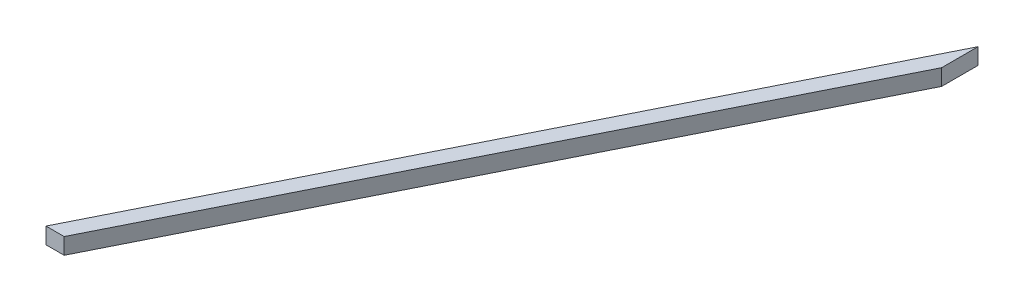
ISO-10303-21;
HEADER;
FILE_DESCRIPTION(('STEP AP214'),'2;1');
FILE_NAME('part.step','',(''),(''),'','','');
FILE_SCHEMA(('AUTOMOTIVE_DESIGN { 1 0 10303 214 1 1 1 1 }'));
ENDSEC;
DATA;
#1=APPLICATION_CONTEXT('core data for automotive mechanical design processes');
#2=APPLICATION_PROTOCOL_DEFINITION('international standard','automotive_design',2000,#1);
#3=PRODUCT_CONTEXT('',#1,'mechanical');
#4=PRODUCT('Part','Part','',(#3));
#5=PRODUCT_RELATED_PRODUCT_CATEGORY('part','',(#4));
#6=PRODUCT_DEFINITION_FORMATION('','',#4);
#7=PRODUCT_DEFINITION_CONTEXT('part definition',#1,'design');
#8=PRODUCT_DEFINITION('design','',#6,#7);
#9=PRODUCT_DEFINITION_SHAPE('','',#8);
#10=(LENGTH_UNIT() NAMED_UNIT(*) SI_UNIT(.MILLI.,.METRE.));
#11=(NAMED_UNIT(*) PLANE_ANGLE_UNIT() SI_UNIT($,.RADIAN.));
#12=(NAMED_UNIT(*) SI_UNIT($,.STERADIAN.) SOLID_ANGLE_UNIT());
#13=UNCERTAINTY_MEASURE_WITH_UNIT(LENGTH_MEASURE(1.E-05),#10,'distance_accuracy_value','');
#14=(GEOMETRIC_REPRESENTATION_CONTEXT(3) GLOBAL_UNCERTAINTY_ASSIGNED_CONTEXT((#13)) GLOBAL_UNIT_ASSIGNED_CONTEXT((#10,
#11,#12)) REPRESENTATION_CONTEXT('',''));
#15=CARTESIAN_POINT('',(0.,0.,0.));
#16=DIRECTION('',(0.,0.,1.));
#17=DIRECTION('',(1.,0.,0.));
#18=AXIS2_PLACEMENT_3D('',#15,#16,#17);
#19=CARTESIAN_POINT('',(-459.084020271651,25.4,-229.542010135826));
#20=DIRECTION('',(-0.894427190999916,0.,-0.447213595499958));
#21=DIRECTION('',(-0.447213595499958,0.,0.894427190999916));
#22=AXIS2_PLACEMENT_3D('',#19,#20,#21);
#23=PLANE('',#22);
#24=DIRECTION('',(0.447213595499958,0.,-0.894427190999916));
#25=VECTOR('',#24,1.);
#26=CARTESIAN_POINT('',(-459.084020271651,0.,-229.542010135826));
#27=LINE('',#26,#25);
#28=CARTESIAN_POINT('',(-615.813253187665,0.,83.9164556962026));
#29=VERTEX_POINT('',#28);
#30=CARTESIAN_POINT('',(-130.215189873418,0.,-887.279670932293));
#31=VERTEX_POINT('',#30);
#32=EDGE_CURVE('E109',#29,#31,#27,.T.);
#33=ORIENTED_EDGE('',*,*,#32,.F.);
#34=DIRECTION('',(0.,-1.,0.));
#35=VECTOR('',#34,1.);
#36=CARTESIAN_POINT('',(-615.813253187665,25.4,83.9164556962026));
#37=LINE('',#36,#35);
#38=CARTESIAN_POINT('',(-615.813253187665,25.4,83.9164556962026));
#39=VERTEX_POINT('',#38);
#40=EDGE_CURVE('E11',#39,#29,#37,.T.);
#41=ORIENTED_EDGE('',*,*,#40,.F.);
#42=DIRECTION('',(0.447213595499958,0.,-0.894427190999916));
#43=VECTOR('',#42,1.);
#44=CARTESIAN_POINT('',(-459.084020271651,25.4,-229.542010135826));
#45=LINE('',#44,#43);
#46=CARTESIAN_POINT('',(-130.215189873418,25.4,-887.279670932293));
#47=VERTEX_POINT('',#46);
#48=EDGE_CURVE('E99',#39,#47,#45,.T.);
#49=ORIENTED_EDGE('',*,*,#48,.T.);
#50=DIRECTION('',(0.,-1.,0.));
#51=VECTOR('',#50,1.);
#52=CARTESIAN_POINT('',(-130.215189873418,25.4,-887.279670932293));
#53=LINE('',#52,#51);
#54=EDGE_CURVE('E80',#47,#31,#53,.T.);
#55=ORIENTED_EDGE('',*,*,#54,.T.);
#56=EDGE_LOOP('',(#33,#41,#49,#55));
#57=FACE_BOUND('',#56,.T.);
#58=ADVANCED_FACE('F41',(#57),#23,.T.);
#59=CARTESIAN_POINT('',(0.,25.4,83.9164556962026));
#60=DIRECTION('',(0.,0.,1.));
#61=DIRECTION('',(1.,0.,0.));
#62=AXIS2_PLACEMENT_3D('',#59,#60,#61);
#63=PLANE('',#62);
#64=DIRECTION('',(-1.,0.,0.));
#65=VECTOR('',#64,1.);
#66=CARTESIAN_POINT('',(0.,0.,83.9164556962026));
#67=LINE('',#66,#65);
#68=CARTESIAN_POINT('',(-587.415189873418,0.,83.9164556962026));
#69=VERTEX_POINT('',#68);
#70=EDGE_CURVE('E91',#69,#29,#67,.T.);
#71=ORIENTED_EDGE('',*,*,#70,.F.);
#72=DIRECTION('',(0.,-1.,0.));
#73=VECTOR('',#72,1.);
#74=CARTESIAN_POINT('',(-587.415189873418,25.4,83.9164556962026));
#75=LINE('',#74,#73);
#76=CARTESIAN_POINT('',(-587.415189873418,25.4,83.9164556962026));
#77=VERTEX_POINT('',#76);
#78=EDGE_CURVE('E50',#77,#69,#75,.T.);
#79=ORIENTED_EDGE('',*,*,#78,.F.);
#80=DIRECTION('',(-1.,0.,0.));
#81=VECTOR('',#80,1.);
#82=CARTESIAN_POINT('',(0.,25.4,83.9164556962026));
#83=LINE('',#82,#81);
#84=EDGE_CURVE('E89',#77,#39,#83,.T.);
#85=ORIENTED_EDGE('',*,*,#84,.T.);
#86=ORIENTED_EDGE('',*,*,#40,.T.);
#87=EDGE_LOOP('',(#71,#79,#85,#86));
#88=FACE_BOUND('',#87,.T.);
#89=ADVANCED_FACE('F88',(#88),#63,.T.);
#90=CARTESIAN_POINT('',(-436.365569620253,25.4,-218.182784810127));
#91=DIRECTION('',(0.894427190999916,0.,0.447213595499958));
#92=DIRECTION('',(0.447213595499958,0.,-0.894427190999916));
#93=AXIS2_PLACEMENT_3D('',#90,#91,#92);
#94=PLANE('',#93);
#95=DIRECTION('',(-0.447213595499958,0.,0.894427190999916));
#96=VECTOR('',#95,1.);
#97=CARTESIAN_POINT('',(-436.365569620253,0.,-218.182784810127));
#98=LINE('',#97,#96);
#99=CARTESIAN_POINT('',(-130.215189873418,0.,-830.483544303797));
#100=VERTEX_POINT('',#99);
#101=EDGE_CURVE('E115',#100,#69,#98,.T.);
#102=ORIENTED_EDGE('',*,*,#101,.F.);
#103=DIRECTION('',(0.,-1.,0.));
#104=VECTOR('',#103,1.);
#105=CARTESIAN_POINT('',(-130.215189873418,25.4,-830.483544303797));
#106=LINE('',#105,#104);
#107=CARTESIAN_POINT('',(-130.215189873418,25.4,-830.483544303797));
#108=VERTEX_POINT('',#107);
#109=EDGE_CURVE('E73',#108,#100,#106,.T.);
#110=ORIENTED_EDGE('',*,*,#109,.F.);
#111=DIRECTION('',(-0.447213595499958,0.,0.894427190999916));
#112=VECTOR('',#111,1.);
#113=CARTESIAN_POINT('',(-436.365569620253,25.4,-218.182784810127));
#114=LINE('',#113,#112);
#115=EDGE_CURVE('E98',#108,#77,#114,.T.);
#116=ORIENTED_EDGE('',*,*,#115,.T.);
#117=ORIENTED_EDGE('',*,*,#78,.T.);
#118=EDGE_LOOP('',(#102,#110,#116,#117));
#119=FACE_BOUND('',#118,.T.);
#120=ADVANCED_FACE('F102',(#119),#94,.T.);
#121=CARTESIAN_POINT('',(-130.215189873424,25.4,-8.90884091703312E-13));
#122=DIRECTION('',(-1.,0.,0.));
#123=DIRECTION('',(0.,0.,1.));
#124=AXIS2_PLACEMENT_3D('',#121,#122,#123);
#125=PLANE('',#124);
#126=DIRECTION('',(0.,0.,-1.));
#127=VECTOR('',#126,1.);
#128=CARTESIAN_POINT('',(-130.215189873424,0.,-8.90884091703312E-13));
#129=LINE('',#128,#127);
#130=EDGE_CURVE('E118',#100,#31,#129,.T.);
#131=ORIENTED_EDGE('',*,*,#130,.T.);
#132=ORIENTED_EDGE('',*,*,#54,.F.);
#133=DIRECTION('',(0.,0.,-1.));
#134=VECTOR('',#133,1.);
#135=CARTESIAN_POINT('',(-130.215189873424,25.4,-8.90884091703312E-13));
#136=LINE('',#135,#134);
#137=EDGE_CURVE('E58',#108,#47,#136,.T.);
#138=ORIENTED_EDGE('',*,*,#137,.F.);
#139=ORIENTED_EDGE('',*,*,#109,.T.);
#140=EDGE_LOOP('',(#131,#132,#138,#139));
#141=FACE_BOUND('',#140,.T.);
#142=ADVANCED_FACE('F132',(#141),#125,.F.);
#143=CARTESIAN_POINT('',(0.,25.4,0.));
#144=DIRECTION('',(0.,1.,0.));
#145=DIRECTION('',(0.,0.,1.));
#146=AXIS2_PLACEMENT_3D('',#143,#144,#145);
#147=PLANE('',#146);
#148=ORIENTED_EDGE('',*,*,#48,.F.);
#149=ORIENTED_EDGE('',*,*,#84,.F.);
#150=ORIENTED_EDGE('',*,*,#115,.F.);
#151=ORIENTED_EDGE('',*,*,#137,.T.);
#152=EDGE_LOOP('',(#148,#149,#150,#151));
#153=FACE_BOUND('',#152,.T.);
#154=ADVANCED_FACE('F97',(#153),#147,.T.);
#155=CARTESIAN_POINT('',(0.,0.,0.));
#156=DIRECTION('',(0.,1.,0.));
#157=DIRECTION('',(0.,0.,1.));
#158=AXIS2_PLACEMENT_3D('',#155,#156,#157);
#159=PLANE('',#158);
#160=ORIENTED_EDGE('',*,*,#32,.T.);
#161=ORIENTED_EDGE('',*,*,#130,.F.);
#162=ORIENTED_EDGE('',*,*,#101,.T.);
#163=ORIENTED_EDGE('',*,*,#70,.T.);
#164=EDGE_LOOP('',(#160,#161,#162,#163));
#165=FACE_BOUND('',#164,.T.);
#166=ADVANCED_FACE('F137',(#165),#159,.F.);
#167=CLOSED_SHELL('',(#58,#89,#120,#142,#154,#166));
#168=MANIFOLD_SOLID_BREP('B2',#167);
#169=ADVANCED_BREP_SHAPE_REPRESENTATION('',(#18,#168),#14);
#170=SHAPE_DEFINITION_REPRESENTATION(#9,#169);
ENDSEC;
END-ISO-10303-21;
